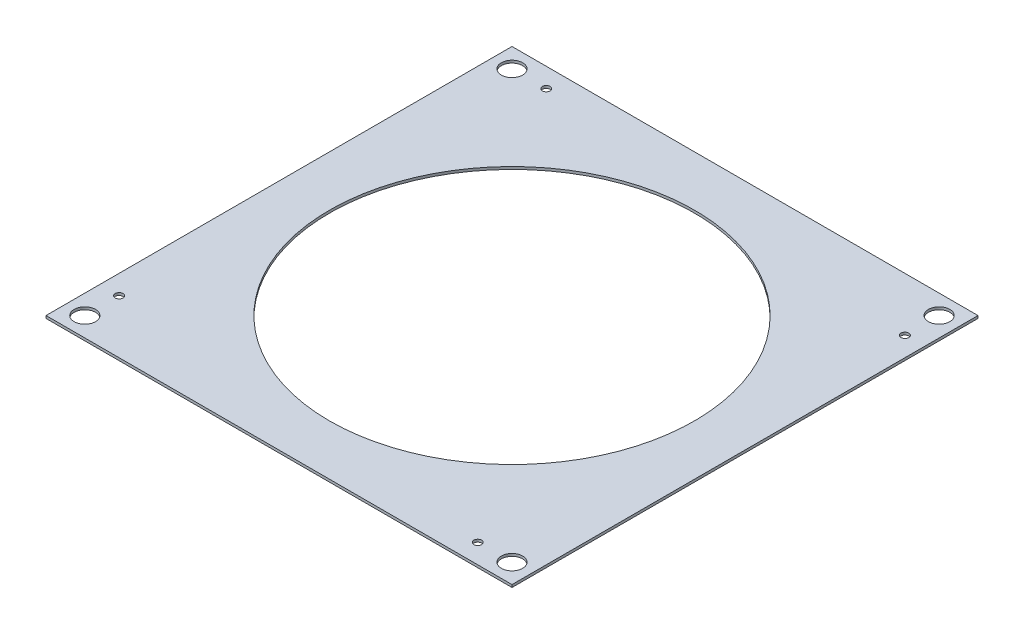
ISO-10303-21;
HEADER;
FILE_DESCRIPTION(('STEP AP214'),'2;1');
FILE_NAME('part.step','',(''),(''),'','','');
FILE_SCHEMA(('AUTOMOTIVE_DESIGN { 1 0 10303 214 1 1 1 1 }'));
ENDSEC;
DATA;
#1=APPLICATION_CONTEXT('core data for automotive mechanical design processes');
#2=APPLICATION_PROTOCOL_DEFINITION('international standard','automotive_design',2000,#1);
#3=PRODUCT_CONTEXT('',#1,'mechanical');
#4=PRODUCT('Part','Part','',(#3));
#5=PRODUCT_RELATED_PRODUCT_CATEGORY('part','',(#4));
#6=PRODUCT_DEFINITION_FORMATION('','',#4);
#7=PRODUCT_DEFINITION_CONTEXT('part definition',#1,'design');
#8=PRODUCT_DEFINITION('design','',#6,#7);
#9=PRODUCT_DEFINITION_SHAPE('','',#8);
#10=(LENGTH_UNIT() NAMED_UNIT(*) SI_UNIT(.MILLI.,.METRE.));
#11=(NAMED_UNIT(*) PLANE_ANGLE_UNIT() SI_UNIT($,.RADIAN.));
#12=(NAMED_UNIT(*) SI_UNIT($,.STERADIAN.) SOLID_ANGLE_UNIT());
#13=UNCERTAINTY_MEASURE_WITH_UNIT(LENGTH_MEASURE(1.E-05),#10,'distance_accuracy_value','');
#14=(GEOMETRIC_REPRESENTATION_CONTEXT(3) GLOBAL_UNCERTAINTY_ASSIGNED_CONTEXT((#13)) GLOBAL_UNIT_ASSIGNED_CONTEXT((#10,
#11,#12)) REPRESENTATION_CONTEXT('',''));
#15=CARTESIAN_POINT('',(0.,0.,0.));
#16=DIRECTION('',(0.,0.,1.));
#17=DIRECTION('',(1.,0.,0.));
#18=AXIS2_PLACEMENT_3D('',#15,#16,#17);
#19=CARTESIAN_POINT('',(0.,0.4191,0.));
#20=DIRECTION('',(0.,-1.,0.));
#21=DIRECTION('',(0.,0.,-1.));
#22=AXIS2_PLACEMENT_3D('',#19,#20,#21);
#23=PLANE('',#22);
#24=CARTESIAN_POINT('',(69.8499999999993,0.4191,-69.8500000000007));
#25=DIRECTION('',(0.,1.,0.));
#26=DIRECTION('',(-1.,0.,0.));
#27=AXIS2_PLACEMENT_3D('',#24,#25,#26);
#28=CIRCLE('',#27,3.49249999999999);
#29=CARTESIAN_POINT('',(66.3574999999993,0.4191,-69.8500000000007));
#30=VERTEX_POINT('',#29);
#31=EDGE_CURVE('E180',#30,#30,#28,.T.);
#32=ORIENTED_EDGE('',*,*,#31,.F.);
#33=EDGE_LOOP('',(#32));
#34=FACE_BOUND('',#33,.T.);
#35=CARTESIAN_POINT('',(58.6472492334403,0.4191,69.85));
#36=DIRECTION('',(0.,1.,0.));
#37=DIRECTION('',(0.,0.,-1.));
#38=AXIS2_PLACEMENT_3D('',#35,#36,#37);
#39=CIRCLE('',#38,1.27);
#40=CARTESIAN_POINT('',(58.6472492334403,0.4191,68.58));
#41=VERTEX_POINT('',#40);
#42=EDGE_CURVE('E189',#41,#41,#39,.T.);
#43=ORIENTED_EDGE('',*,*,#42,.F.);
#44=EDGE_LOOP('',(#43));
#45=FACE_BOUND('',#44,.T.);
#46=CARTESIAN_POINT('',(69.85,0.4191,69.85));
#47=DIRECTION('',(0.,1.,0.));
#48=DIRECTION('',(0.,0.,-1.));
#49=AXIS2_PLACEMENT_3D('',#46,#47,#48);
#50=CIRCLE('',#49,3.49249999999999);
#51=CARTESIAN_POINT('',(69.85,0.4191,66.3575));
#52=VERTEX_POINT('',#51);
#53=EDGE_CURVE('E164',#52,#52,#50,.T.);
#54=ORIENTED_EDGE('',*,*,#53,.F.);
#55=EDGE_LOOP('',(#54));
#56=FACE_BOUND('',#55,.T.);
#57=CARTESIAN_POINT('',(-69.8499999999998,0.4191,58.6472492334405));
#58=DIRECTION('',(0.,1.,0.));
#59=DIRECTION('',(1.,0.,0.));
#60=AXIS2_PLACEMENT_3D('',#57,#58,#59);
#61=CIRCLE('',#60,1.27);
#62=CARTESIAN_POINT('',(-68.5799999999998,0.4191,58.6472492334405));
#63=VERTEX_POINT('',#62);
#64=EDGE_CURVE('E173',#63,#63,#61,.T.);
#65=ORIENTED_EDGE('',*,*,#64,.F.);
#66=EDGE_LOOP('',(#65));
#67=FACE_BOUND('',#66,.T.);
#68=CARTESIAN_POINT('',(69.8499999999994,0.4191,-58.647249233441));
#69=DIRECTION('',(0.,1.,0.));
#70=DIRECTION('',(-1.,0.,0.));
#71=AXIS2_PLACEMENT_3D('',#68,#69,#70);
#72=CIRCLE('',#71,1.27);
#73=CARTESIAN_POINT('',(68.5799999999994,0.4191,-58.647249233441));
#74=VERTEX_POINT('',#73);
#75=EDGE_CURVE('E196',#74,#74,#72,.T.);
#76=ORIENTED_EDGE('',*,*,#75,.F.);
#77=EDGE_LOOP('',(#76));
#78=FACE_BOUND('',#77,.T.);
#79=CARTESIAN_POINT('',(-69.8499999999998,0.4191,69.8500000000003));
#80=DIRECTION('',(0.,1.,0.));
#81=DIRECTION('',(1.,0.,0.));
#82=AXIS2_PLACEMENT_3D('',#79,#80,#81);
#83=CIRCLE('',#82,3.49249999999999);
#84=CARTESIAN_POINT('',(-66.3574999999998,0.4191,69.8500000000002));
#85=VERTEX_POINT('',#84);
#86=EDGE_CURVE('E156',#85,#85,#83,.T.);
#87=ORIENTED_EDGE('',*,*,#86,.F.);
#88=EDGE_LOOP('',(#87));
#89=FACE_BOUND('',#88,.T.);
#90=CARTESIAN_POINT('',(-69.85,0.4191,-69.85));
#91=DIRECTION('',(0.,1.,0.));
#92=DIRECTION('',(0.,0.,1.));
#93=AXIS2_PLACEMENT_3D('',#90,#91,#92);
#94=CIRCLE('',#93,3.49249999999999);
#95=CARTESIAN_POINT('',(-69.85,0.4191,-66.3575));
#96=VERTEX_POINT('',#95);
#97=EDGE_CURVE('E149',#96,#96,#94,.T.);
#98=ORIENTED_EDGE('',*,*,#97,.F.);
#99=EDGE_LOOP('',(#98));
#100=FACE_BOUND('',#99,.T.);
#101=CARTESIAN_POINT('',(-58.6472492334403,0.4191,-69.85));
#102=DIRECTION('',(0.,1.,0.));
#103=DIRECTION('',(0.,0.,1.));
#104=AXIS2_PLACEMENT_3D('',#101,#102,#103);
#105=CIRCLE('',#104,1.27);
#106=CARTESIAN_POINT('',(-58.6472492334403,0.4191,-68.58));
#107=VERTEX_POINT('',#106);
#108=EDGE_CURVE('E140',#107,#107,#105,.T.);
#109=ORIENTED_EDGE('',*,*,#108,.F.);
#110=EDGE_LOOP('',(#109));
#111=FACE_BOUND('',#110,.T.);
#112=DIRECTION('',(0.,0.,-1.));
#113=VECTOR('',#112,1.);
#114=CARTESIAN_POINT('',(76.2,0.4191,76.2));
#115=LINE('',#114,#113);
#116=CARTESIAN_POINT('',(76.2,0.4191,76.2));
#117=VERTEX_POINT('',#116);
#118=CARTESIAN_POINT('',(76.2,0.4191,-76.2));
#119=VERTEX_POINT('',#118);
#120=EDGE_CURVE('E94',#117,#119,#115,.T.);
#121=ORIENTED_EDGE('',*,*,#120,.T.);
#122=DIRECTION('',(-1.,0.,0.));
#123=VECTOR('',#122,1.);
#124=CARTESIAN_POINT('',(-76.2,0.4191,-76.2));
#125=LINE('',#124,#123);
#126=CARTESIAN_POINT('',(-76.2,0.4191,-76.2));
#127=VERTEX_POINT('',#126);
#128=EDGE_CURVE('E89',#119,#127,#125,.T.);
#129=ORIENTED_EDGE('',*,*,#128,.T.);
#130=DIRECTION('',(0.,0.,1.));
#131=VECTOR('',#130,1.);
#132=CARTESIAN_POINT('',(-76.2,0.4191,76.2));
#133=LINE('',#132,#131);
#134=CARTESIAN_POINT('',(-76.2,0.4191,76.2));
#135=VERTEX_POINT('',#134);
#136=EDGE_CURVE('E92',#127,#135,#133,.T.);
#137=ORIENTED_EDGE('',*,*,#136,.T.);
#138=DIRECTION('',(1.,0.,0.));
#139=VECTOR('',#138,1.);
#140=CARTESIAN_POINT('',(-76.2,0.4191,76.2));
#141=LINE('',#140,#139);
#142=EDGE_CURVE('E59',#135,#117,#141,.T.);
#143=ORIENTED_EDGE('',*,*,#142,.T.);
#144=EDGE_LOOP('',(#121,#129,#137,#143));
#145=FACE_BOUND('',#144,.T.);
#146=CARTESIAN_POINT('',(0.,0.4191,0.));
#147=DIRECTION('',(0.,1.,0.));
#148=DIRECTION('',(0.,0.,1.));
#149=AXIS2_PLACEMENT_3D('',#146,#147,#148);
#150=CIRCLE('',#149,59.69);
#151=CARTESIAN_POINT('',(0.,0.4191,59.69));
#152=VERTEX_POINT('',#151);
#153=EDGE_CURVE('E114',#152,#152,#150,.T.);
#154=ORIENTED_EDGE('',*,*,#153,.F.);
#155=EDGE_LOOP('',(#154));
#156=FACE_BOUND('',#155,.T.);
#157=ADVANCED_FACE('F41',(#34,#45,#56,#67,#78,#89,#100,#111,#145,#156),#23,.F.);
#158=CARTESIAN_POINT('',(0.,-0.4191,0.));
#159=DIRECTION('',(0.,-1.,0.));
#160=DIRECTION('',(0.,0.,-1.));
#161=AXIS2_PLACEMENT_3D('',#158,#159,#160);
#162=PLANE('',#161);
#163=CARTESIAN_POINT('',(69.8499999999993,-0.4191,-69.8500000000007));
#164=DIRECTION('',(0.,1.,0.));
#165=DIRECTION('',(-1.,0.,0.));
#166=AXIS2_PLACEMENT_3D('',#163,#164,#165);
#167=CIRCLE('',#166,3.49249999999999);
#168=CARTESIAN_POINT('',(66.3574999999993,-0.4191,-69.8500000000007));
#169=VERTEX_POINT('',#168);
#170=EDGE_CURVE('E184',#169,#169,#167,.T.);
#171=ORIENTED_EDGE('',*,*,#170,.T.);
#172=EDGE_LOOP('',(#171));
#173=FACE_BOUND('',#172,.T.);
#174=CARTESIAN_POINT('',(58.6472492334403,-0.4191,69.85));
#175=DIRECTION('',(0.,1.,0.));
#176=DIRECTION('',(0.,0.,-1.));
#177=AXIS2_PLACEMENT_3D('',#174,#175,#176);
#178=CIRCLE('',#177,1.27);
#179=CARTESIAN_POINT('',(58.6472492334403,-0.4191,68.58));
#180=VERTEX_POINT('',#179);
#181=EDGE_CURVE('E169',#180,#180,#178,.T.);
#182=ORIENTED_EDGE('',*,*,#181,.T.);
#183=EDGE_LOOP('',(#182));
#184=FACE_BOUND('',#183,.T.);
#185=CARTESIAN_POINT('',(69.85,-0.4191,69.85));
#186=DIRECTION('',(0.,1.,0.));
#187=DIRECTION('',(0.,0.,-1.));
#188=AXIS2_PLACEMENT_3D('',#185,#186,#187);
#189=CIRCLE('',#188,3.49249999999999);
#190=CARTESIAN_POINT('',(69.85,-0.4191,66.3575));
#191=VERTEX_POINT('',#190);
#192=EDGE_CURVE('E168',#191,#191,#189,.T.);
#193=ORIENTED_EDGE('',*,*,#192,.T.);
#194=EDGE_LOOP('',(#193));
#195=FACE_BOUND('',#194,.T.);
#196=CARTESIAN_POINT('',(-69.8499999999998,-0.4191,58.6472492334405));
#197=DIRECTION('',(0.,1.,0.));
#198=DIRECTION('',(1.,0.,0.));
#199=AXIS2_PLACEMENT_3D('',#196,#197,#198);
#200=CIRCLE('',#199,1.27);
#201=CARTESIAN_POINT('',(-68.5799999999998,-0.4191,58.6472492334405));
#202=VERTEX_POINT('',#201);
#203=EDGE_CURVE('E160',#202,#202,#200,.T.);
#204=ORIENTED_EDGE('',*,*,#203,.T.);
#205=EDGE_LOOP('',(#204));
#206=FACE_BOUND('',#205,.T.);
#207=CARTESIAN_POINT('',(69.8499999999994,-0.4191,-58.647249233441));
#208=DIRECTION('',(0.,1.,0.));
#209=DIRECTION('',(-1.,0.,0.));
#210=AXIS2_PLACEMENT_3D('',#207,#208,#209);
#211=CIRCLE('',#210,1.27);
#212=CARTESIAN_POINT('',(68.5799999999994,-0.4191,-58.647249233441));
#213=VERTEX_POINT('',#212);
#214=EDGE_CURVE('E185',#213,#213,#211,.T.);
#215=ORIENTED_EDGE('',*,*,#214,.T.);
#216=EDGE_LOOP('',(#215));
#217=FACE_BOUND('',#216,.T.);
#218=CARTESIAN_POINT('',(-69.8499999999998,-0.4191,69.8500000000003));
#219=DIRECTION('',(0.,1.,0.));
#220=DIRECTION('',(1.,0.,0.));
#221=AXIS2_PLACEMENT_3D('',#218,#219,#220);
#222=CIRCLE('',#221,3.49249999999999);
#223=CARTESIAN_POINT('',(-66.3574999999998,-0.4191,69.8500000000002));
#224=VERTEX_POINT('',#223);
#225=EDGE_CURVE('E145',#224,#224,#222,.T.);
#226=ORIENTED_EDGE('',*,*,#225,.T.);
#227=EDGE_LOOP('',(#226));
#228=FACE_BOUND('',#227,.T.);
#229=CARTESIAN_POINT('',(-69.85,-0.4191,-69.85));
#230=DIRECTION('',(0.,1.,0.));
#231=DIRECTION('',(0.,0.,1.));
#232=AXIS2_PLACEMENT_3D('',#229,#230,#231);
#233=CIRCLE('',#232,3.49249999999999);
#234=CARTESIAN_POINT('',(-69.85,-0.4191,-66.3575));
#235=VERTEX_POINT('',#234);
#236=EDGE_CURVE('E136',#235,#235,#233,.T.);
#237=ORIENTED_EDGE('',*,*,#236,.T.);
#238=EDGE_LOOP('',(#237));
#239=FACE_BOUND('',#238,.T.);
#240=CARTESIAN_POINT('',(-58.6472492334403,-0.4191,-69.85));
#241=DIRECTION('',(0.,1.,0.));
#242=DIRECTION('',(0.,0.,1.));
#243=AXIS2_PLACEMENT_3D('',#240,#241,#242);
#244=CIRCLE('',#243,1.27);
#245=CARTESIAN_POINT('',(-58.6472492334403,-0.4191,-68.58));
#246=VERTEX_POINT('',#245);
#247=EDGE_CURVE('E144',#246,#246,#244,.T.);
#248=ORIENTED_EDGE('',*,*,#247,.T.);
#249=EDGE_LOOP('',(#248));
#250=FACE_BOUND('',#249,.T.);
#251=DIRECTION('',(0.,0.,-1.));
#252=VECTOR('',#251,1.);
#253=CARTESIAN_POINT('',(76.2,-0.4191,76.2));
#254=LINE('',#253,#252);
#255=CARTESIAN_POINT('',(76.2,-0.4191,76.2));
#256=VERTEX_POINT('',#255);
#257=CARTESIAN_POINT('',(76.2,-0.4191,-76.2));
#258=VERTEX_POINT('',#257);
#259=EDGE_CURVE('E110',#256,#258,#254,.T.);
#260=ORIENTED_EDGE('',*,*,#259,.F.);
#261=DIRECTION('',(1.,0.,0.));
#262=VECTOR('',#261,1.);
#263=CARTESIAN_POINT('',(-76.2,-0.4191,76.2));
#264=LINE('',#263,#262);
#265=CARTESIAN_POINT('',(-76.2,-0.4191,76.2));
#266=VERTEX_POINT('',#265);
#267=EDGE_CURVE('E82',#266,#256,#264,.T.);
#268=ORIENTED_EDGE('',*,*,#267,.F.);
#269=DIRECTION('',(0.,0.,1.));
#270=VECTOR('',#269,1.);
#271=CARTESIAN_POINT('',(-76.2,-0.4191,76.2));
#272=LINE('',#271,#270);
#273=CARTESIAN_POINT('',(-76.2,-0.4191,-76.2));
#274=VERTEX_POINT('',#273);
#275=EDGE_CURVE('E76',#274,#266,#272,.T.);
#276=ORIENTED_EDGE('',*,*,#275,.F.);
#277=DIRECTION('',(-1.,0.,0.));
#278=VECTOR('',#277,1.);
#279=CARTESIAN_POINT('',(-76.2,-0.4191,-76.2));
#280=LINE('',#279,#278);
#281=EDGE_CURVE('E99',#258,#274,#280,.T.);
#282=ORIENTED_EDGE('',*,*,#281,.F.);
#283=EDGE_LOOP('',(#260,#268,#276,#282));
#284=FACE_BOUND('',#283,.T.);
#285=CARTESIAN_POINT('',(0.,-0.4191,0.));
#286=DIRECTION('',(0.,1.,0.));
#287=DIRECTION('',(0.,0.,1.));
#288=AXIS2_PLACEMENT_3D('',#285,#286,#287);
#289=CIRCLE('',#288,59.69);
#290=CARTESIAN_POINT('',(0.,-0.4191,59.69));
#291=VERTEX_POINT('',#290);
#292=EDGE_CURVE('E132',#291,#291,#289,.T.);
#293=ORIENTED_EDGE('',*,*,#292,.T.);
#294=EDGE_LOOP('',(#293));
#295=FACE_BOUND('',#294,.T.);
#296=ADVANCED_FACE('F127',(#173,#184,#195,#206,#217,#228,#239,#250,#284,#295),#162,.T.);
#297=CARTESIAN_POINT('',(76.2,0.4191,76.2));
#298=DIRECTION('',(-1.,0.,0.));
#299=DIRECTION('',(0.,0.,1.));
#300=AXIS2_PLACEMENT_3D('',#297,#298,#299);
#301=PLANE('',#300);
#302=ORIENTED_EDGE('',*,*,#259,.T.);
#303=DIRECTION('',(0.,-1.,0.));
#304=VECTOR('',#303,1.);
#305=CARTESIAN_POINT('',(76.2,0.4191,-76.2));
#306=LINE('',#305,#304);
#307=EDGE_CURVE('E11',#119,#258,#306,.T.);
#308=ORIENTED_EDGE('',*,*,#307,.F.);
#309=ORIENTED_EDGE('',*,*,#120,.F.);
#310=DIRECTION('',(0.,-1.,0.));
#311=VECTOR('',#310,1.);
#312=CARTESIAN_POINT('',(76.2,0.4191,76.2));
#313=LINE('',#312,#311);
#314=EDGE_CURVE('E106',#117,#256,#313,.T.);
#315=ORIENTED_EDGE('',*,*,#314,.T.);
#316=EDGE_LOOP('',(#302,#308,#309,#315));
#317=FACE_BOUND('',#316,.T.);
#318=ADVANCED_FACE('F43',(#317),#301,.F.);
#319=CARTESIAN_POINT('',(-76.2,0.4191,-76.2));
#320=DIRECTION('',(0.,0.,1.));
#321=DIRECTION('',(1.,0.,0.));
#322=AXIS2_PLACEMENT_3D('',#319,#320,#321);
#323=PLANE('',#322);
#324=ORIENTED_EDGE('',*,*,#281,.T.);
#325=DIRECTION('',(0.,-1.,0.));
#326=VECTOR('',#325,1.);
#327=CARTESIAN_POINT('',(-76.2,0.4191,-76.2));
#328=LINE('',#327,#326);
#329=EDGE_CURVE('E51',#127,#274,#328,.T.);
#330=ORIENTED_EDGE('',*,*,#329,.F.);
#331=ORIENTED_EDGE('',*,*,#128,.F.);
#332=ORIENTED_EDGE('',*,*,#307,.T.);
#333=EDGE_LOOP('',(#324,#330,#331,#332));
#334=FACE_BOUND('',#333,.T.);
#335=ADVANCED_FACE('F98',(#334),#323,.F.);
#336=CARTESIAN_POINT('',(-76.2,0.4191,76.2));
#337=DIRECTION('',(1.,0.,0.));
#338=DIRECTION('',(0.,0.,-1.));
#339=AXIS2_PLACEMENT_3D('',#336,#337,#338);
#340=PLANE('',#339);
#341=ORIENTED_EDGE('',*,*,#275,.T.);
#342=DIRECTION('',(0.,-1.,0.));
#343=VECTOR('',#342,1.);
#344=CARTESIAN_POINT('',(-76.2,0.4191,76.2));
#345=LINE('',#344,#343);
#346=EDGE_CURVE('E101',#135,#266,#345,.T.);
#347=ORIENTED_EDGE('',*,*,#346,.F.);
#348=ORIENTED_EDGE('',*,*,#136,.F.);
#349=ORIENTED_EDGE('',*,*,#329,.T.);
#350=EDGE_LOOP('',(#341,#347,#348,#349));
#351=FACE_BOUND('',#350,.T.);
#352=ADVANCED_FACE('F102',(#351),#340,.F.);
#353=CARTESIAN_POINT('',(-76.2,0.4191,76.2));
#354=DIRECTION('',(0.,0.,-1.));
#355=DIRECTION('',(-1.,0.,0.));
#356=AXIS2_PLACEMENT_3D('',#353,#354,#355);
#357=PLANE('',#356);
#358=ORIENTED_EDGE('',*,*,#267,.T.);
#359=ORIENTED_EDGE('',*,*,#314,.F.);
#360=ORIENTED_EDGE('',*,*,#142,.F.);
#361=ORIENTED_EDGE('',*,*,#346,.T.);
#362=EDGE_LOOP('',(#358,#359,#360,#361));
#363=FACE_BOUND('',#362,.T.);
#364=ADVANCED_FACE('F124',(#363),#357,.F.);
#365=CARTESIAN_POINT('',(0.,0.4191,0.));
#366=DIRECTION('',(0.,-1.,0.));
#367=DIRECTION('',(0.,0.,-1.));
#368=AXIS2_PLACEMENT_3D('',#365,#366,#367);
#369=CYLINDRICAL_SURFACE('',#368,59.69);
#370=ORIENTED_EDGE('',*,*,#153,.T.);
#371=EDGE_LOOP('',(#370));
#372=FACE_BOUND('',#371,.T.);
#373=ORIENTED_EDGE('',*,*,#292,.F.);
#374=EDGE_LOOP('',(#373));
#375=FACE_BOUND('',#374,.T.);
#376=ADVANCED_FACE('F227',(#372,#375),#369,.F.);
#377=CARTESIAN_POINT('',(-58.6472492334403,-0.4191,-69.85));
#378=DIRECTION('',(0.,1.,0.));
#379=DIRECTION('',(0.,0.,1.));
#380=AXIS2_PLACEMENT_3D('',#377,#378,#379);
#381=CYLINDRICAL_SURFACE('',#380,1.27);
#382=ORIENTED_EDGE('',*,*,#247,.F.);
#383=EDGE_LOOP('',(#382));
#384=FACE_BOUND('',#383,.T.);
#385=ORIENTED_EDGE('',*,*,#108,.T.);
#386=EDGE_LOOP('',(#385));
#387=FACE_BOUND('',#386,.T.);
#388=ADVANCED_FACE('F224',(#384,#387),#381,.F.);
#389=CARTESIAN_POINT('',(-69.85,-0.4191,-69.85));
#390=DIRECTION('',(0.,1.,0.));
#391=DIRECTION('',(0.,0.,1.));
#392=AXIS2_PLACEMENT_3D('',#389,#390,#391);
#393=CYLINDRICAL_SURFACE('',#392,3.49249999999999);
#394=ORIENTED_EDGE('',*,*,#236,.F.);
#395=EDGE_LOOP('',(#394));
#396=FACE_BOUND('',#395,.T.);
#397=ORIENTED_EDGE('',*,*,#97,.T.);
#398=EDGE_LOOP('',(#397));
#399=FACE_BOUND('',#398,.T.);
#400=ADVANCED_FACE('F226',(#396,#399),#393,.F.);
#401=CARTESIAN_POINT('',(-69.8499999999998,-0.4191,69.8500000000003));
#402=DIRECTION('',(0.,1.,0.));
#403=DIRECTION('',(0.,0.,1.));
#404=AXIS2_PLACEMENT_3D('',#401,#402,#403);
#405=CYLINDRICAL_SURFACE('',#404,3.49249999999999);
#406=ORIENTED_EDGE('',*,*,#225,.F.);
#407=EDGE_LOOP('',(#406));
#408=FACE_BOUND('',#407,.T.);
#409=ORIENTED_EDGE('',*,*,#86,.T.);
#410=EDGE_LOOP('',(#409));
#411=FACE_BOUND('',#410,.T.);
#412=ADVANCED_FACE('F210',(#408,#411),#405,.F.);
#413=CARTESIAN_POINT('',(69.8499999999994,-0.4191,-58.647249233441));
#414=DIRECTION('',(0.,1.,0.));
#415=DIRECTION('',(0.,0.,1.));
#416=AXIS2_PLACEMENT_3D('',#413,#414,#415);
#417=CYLINDRICAL_SURFACE('',#416,1.27);
#418=ORIENTED_EDGE('',*,*,#214,.F.);
#419=EDGE_LOOP('',(#418));
#420=FACE_BOUND('',#419,.T.);
#421=ORIENTED_EDGE('',*,*,#75,.T.);
#422=EDGE_LOOP('',(#421));
#423=FACE_BOUND('',#422,.T.);
#424=ADVANCED_FACE('F206',(#420,#423),#417,.F.);
#425=CARTESIAN_POINT('',(-69.8499999999998,-0.4191,58.6472492334405));
#426=DIRECTION('',(0.,1.,0.));
#427=DIRECTION('',(0.,0.,1.));
#428=AXIS2_PLACEMENT_3D('',#425,#426,#427);
#429=CYLINDRICAL_SURFACE('',#428,1.27);
#430=ORIENTED_EDGE('',*,*,#203,.F.);
#431=EDGE_LOOP('',(#430));
#432=FACE_BOUND('',#431,.T.);
#433=ORIENTED_EDGE('',*,*,#64,.T.);
#434=EDGE_LOOP('',(#433));
#435=FACE_BOUND('',#434,.T.);
#436=ADVANCED_FACE('F209',(#432,#435),#429,.F.);
#437=CARTESIAN_POINT('',(69.85,-0.4191,69.85));
#438=DIRECTION('',(0.,1.,0.));
#439=DIRECTION('',(0.,0.,1.));
#440=AXIS2_PLACEMENT_3D('',#437,#438,#439);
#441=CYLINDRICAL_SURFACE('',#440,3.49249999999999);
#442=ORIENTED_EDGE('',*,*,#192,.F.);
#443=EDGE_LOOP('',(#442));
#444=FACE_BOUND('',#443,.T.);
#445=ORIENTED_EDGE('',*,*,#53,.T.);
#446=EDGE_LOOP('',(#445));
#447=FACE_BOUND('',#446,.T.);
#448=ADVANCED_FACE('F315',(#444,#447),#441,.F.);
#449=CARTESIAN_POINT('',(58.6472492334403,-0.4191,69.85));
#450=DIRECTION('',(0.,1.,0.));
#451=DIRECTION('',(0.,0.,1.));
#452=AXIS2_PLACEMENT_3D('',#449,#450,#451);
#453=CYLINDRICAL_SURFACE('',#452,1.27);
#454=ORIENTED_EDGE('',*,*,#181,.F.);
#455=EDGE_LOOP('',(#454));
#456=FACE_BOUND('',#455,.T.);
#457=ORIENTED_EDGE('',*,*,#42,.T.);
#458=EDGE_LOOP('',(#457));
#459=FACE_BOUND('',#458,.T.);
#460=ADVANCED_FACE('F323',(#456,#459),#453,.F.);
#461=CARTESIAN_POINT('',(69.8499999999993,-0.4191,-69.8500000000007));
#462=DIRECTION('',(0.,1.,0.));
#463=DIRECTION('',(0.,0.,1.));
#464=AXIS2_PLACEMENT_3D('',#461,#462,#463);
#465=CYLINDRICAL_SURFACE('',#464,3.49249999999999);
#466=ORIENTED_EDGE('',*,*,#170,.F.);
#467=EDGE_LOOP('',(#466));
#468=FACE_BOUND('',#467,.T.);
#469=ORIENTED_EDGE('',*,*,#31,.T.);
#470=EDGE_LOOP('',(#469));
#471=FACE_BOUND('',#470,.T.);
#472=ADVANCED_FACE('F331',(#468,#471),#465,.F.);
#473=CLOSED_SHELL('',(#157,#296,#318,#335,#352,#364,#376,#388,#400,#412,#424,#436,#448,#460,#472));
#474=MANIFOLD_SOLID_BREP('B2',#473);
#475=ADVANCED_BREP_SHAPE_REPRESENTATION('',(#18,#474),#14);
#476=SHAPE_DEFINITION_REPRESENTATION(#9,#475);
ENDSEC;
END-ISO-10303-21;
